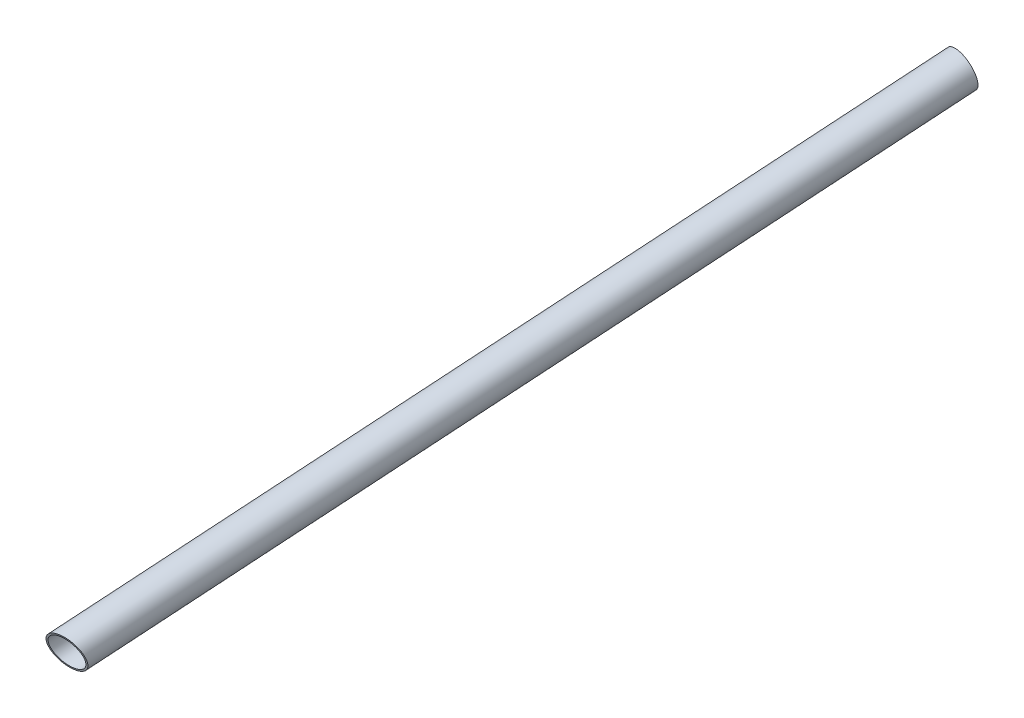
ISO-10303-21;
HEADER;
FILE_DESCRIPTION(('STEP AP214'),'2;1');
FILE_NAME('part.step','',(''),(''),'','','');
FILE_SCHEMA(('AUTOMOTIVE_DESIGN { 1 0 10303 214 1 1 1 1 }'));
ENDSEC;
DATA;
#1=APPLICATION_CONTEXT('core data for automotive mechanical design processes');
#2=APPLICATION_PROTOCOL_DEFINITION('international standard','automotive_design',2000,#1);
#3=PRODUCT_CONTEXT('',#1,'mechanical');
#4=PRODUCT('Part','Part','',(#3));
#5=PRODUCT_RELATED_PRODUCT_CATEGORY('part','',(#4));
#6=PRODUCT_DEFINITION_FORMATION('','',#4);
#7=PRODUCT_DEFINITION_CONTEXT('part definition',#1,'design');
#8=PRODUCT_DEFINITION('design','',#6,#7);
#9=PRODUCT_DEFINITION_SHAPE('','',#8);
#10=(LENGTH_UNIT() NAMED_UNIT(*) SI_UNIT(.MILLI.,.METRE.));
#11=(NAMED_UNIT(*) PLANE_ANGLE_UNIT() SI_UNIT($,.RADIAN.));
#12=(NAMED_UNIT(*) SI_UNIT($,.STERADIAN.) SOLID_ANGLE_UNIT());
#13=UNCERTAINTY_MEASURE_WITH_UNIT(LENGTH_MEASURE(1.E-05),#10,'distance_accuracy_value','');
#14=(GEOMETRIC_REPRESENTATION_CONTEXT(3) GLOBAL_UNCERTAINTY_ASSIGNED_CONTEXT((#13)) GLOBAL_UNIT_ASSIGNED_CONTEXT((#10,
#11,#12)) REPRESENTATION_CONTEXT('',''));
#15=CARTESIAN_POINT('',(0.,0.,0.));
#16=DIRECTION('',(0.,0.,1.));
#17=DIRECTION('',(1.,0.,0.));
#18=AXIS2_PLACEMENT_3D('',#15,#16,#17);
#19=CARTESIAN_POINT('',(160.,500.,-1140.));
#20=DIRECTION('',(-0.143388493553694,-0.215082740330541,0.966011984774675));
#21=DIRECTION('',(0.,-0.976098519192531,-0.21732850901377));
#22=AXIS2_PLACEMENT_3D('',#19,#20,#21);
#23=CYLINDRICAL_SURFACE('',#22,11.3);
#24=CARTESIAN_POINT('',(160.,500.,-1140.));
#25=DIRECTION('',(0.143388493553694,0.215082740330541,-0.966011984774675));
#26=DIRECTION('',(0.395073235453946,-0.907390146819081,-0.143388493553694));
#27=AXIS2_PLACEMENT_3D('',#24,#25,#26);
#28=CIRCLE('',#27,11.3);
#29=CARTESIAN_POINT('',(164.46432756063,489.746491340944,-1141.62028997716));
#30=VERTEX_POINT('',#29);
#31=EDGE_CURVE('E53',#30,#30,#28,.T.);
#32=ORIENTED_EDGE('',*,*,#31,.T.);
#33=EDGE_LOOP('',(#32));
#34=FACE_BOUND('',#33,.T.);
#35=CARTESIAN_POINT('',(80.,380.,-601.037933611912));
#36=DIRECTION('',(0.0877040448988902,-0.311824264686693,0.946083309471727));
#37=DIRECTION('',(-0.915766996856784,0.348518707826595,0.199763654759287));
#38=AXIS2_PLACEMENT_3D('',#35,#36,#37);
#39=ELLIPSE('',#38,11.6684899557684,11.3);
#40=CARTESIAN_POINT('',(69.3143819953524,384.066687041672,-598.706993412826));
#41=VERTEX_POINT('',#40);
#42=EDGE_CURVE('E43',#41,#41,#39,.T.);
#43=ORIENTED_EDGE('',*,*,#42,.T.);
#44=EDGE_LOOP('',(#43));
#45=FACE_BOUND('',#44,.T.);
#46=ADVANCED_FACE('F39',(#34,#45),#23,.F.);
#47=CARTESIAN_POINT('',(160.,500.,-1140.));
#48=DIRECTION('',(-0.143388493553694,-0.215082740330541,0.966011984774675));
#49=DIRECTION('',(0.,-0.976098519192531,-0.21732850901377));
#50=AXIS2_PLACEMENT_3D('',#47,#48,#49);
#51=CYLINDRICAL_SURFACE('',#50,12.5);
#52=CARTESIAN_POINT('',(160.,500.,-1140.));
#53=DIRECTION('',(0.143388493553694,0.215082740330541,-0.966011984774675));
#54=DIRECTION('',(0.395073235453946,-0.907390146819081,-0.143388493553694));
#55=AXIS2_PLACEMENT_3D('',#52,#53,#54);
#56=CIRCLE('',#55,12.5);
#57=CARTESIAN_POINT('',(164.938415443174,488.657623164761,-1141.79235616942));
#58=VERTEX_POINT('',#57);
#59=EDGE_CURVE('E47',#58,#58,#56,.T.);
#60=ORIENTED_EDGE('',*,*,#59,.F.);
#61=EDGE_LOOP('',(#60));
#62=FACE_BOUND('',#61,.T.);
#63=CARTESIAN_POINT('',(80.,380.,-601.037933611912));
#64=DIRECTION('',(0.0877040448988902,-0.311824264686693,0.946083309471727));
#65=DIRECTION('',(-0.915766996856784,0.348518707826595,0.199763654759287));
#66=AXIS2_PLACEMENT_3D('',#63,#64,#65);
#67=ELLIPSE('',#66,12.9076216324872,12.5);
#68=CARTESIAN_POINT('',(68.1796261010535,384.498547612469,-598.459459940356));
#69=VERTEX_POINT('',#68);
#70=EDGE_CURVE('E10',#69,#69,#67,.T.);
#71=ORIENTED_EDGE('',*,*,#70,.F.);
#72=EDGE_LOOP('',(#71));
#73=FACE_BOUND('',#72,.T.);
#74=ADVANCED_FACE('F66',(#62,#73),#51,.T.);
#75=CARTESIAN_POINT('',(160.,500.,-1140.));
#76=DIRECTION('',(0.143388493553694,0.215082740330541,-0.966011984774675));
#77=DIRECTION('',(0.395073235453946,-0.907390146819081,-0.143388493553694));
#78=AXIS2_PLACEMENT_3D('',#75,#76,#77);
#79=PLANE('',#78);
#80=ORIENTED_EDGE('',*,*,#31,.F.);
#81=EDGE_LOOP('',(#80));
#82=FACE_BOUND('',#81,.T.);
#83=ORIENTED_EDGE('',*,*,#59,.T.);
#84=EDGE_LOOP('',(#83));
#85=FACE_BOUND('',#84,.T.);
#86=ADVANCED_FACE('F62',(#82,#85),#79,.T.);
#87=CARTESIAN_POINT('',(80.0000000000001,380.,-601.037933611912));
#88=DIRECTION('',(0.0877040448988902,-0.311824264686693,0.946083309471727));
#89=DIRECTION('',(0.,-0.949743072396233,-0.313030504001389));
#90=AXIS2_PLACEMENT_3D('',#87,#88,#89);
#91=PLANE('',#90);
#92=ORIENTED_EDGE('',*,*,#42,.F.);
#93=EDGE_LOOP('',(#92));
#94=FACE_BOUND('',#93,.T.);
#95=ORIENTED_EDGE('',*,*,#70,.T.);
#96=EDGE_LOOP('',(#95));
#97=FACE_BOUND('',#96,.T.);
#98=ADVANCED_FACE('F41',(#94,#97),#91,.T.);
#99=CLOSED_SHELL('',(#46,#74,#86,#98));
#100=MANIFOLD_SOLID_BREP('B2',#99);
#101=ADVANCED_BREP_SHAPE_REPRESENTATION('',(#18,#100),#14);
#102=SHAPE_DEFINITION_REPRESENTATION(#9,#101);
ENDSEC;
END-ISO-10303-21;
